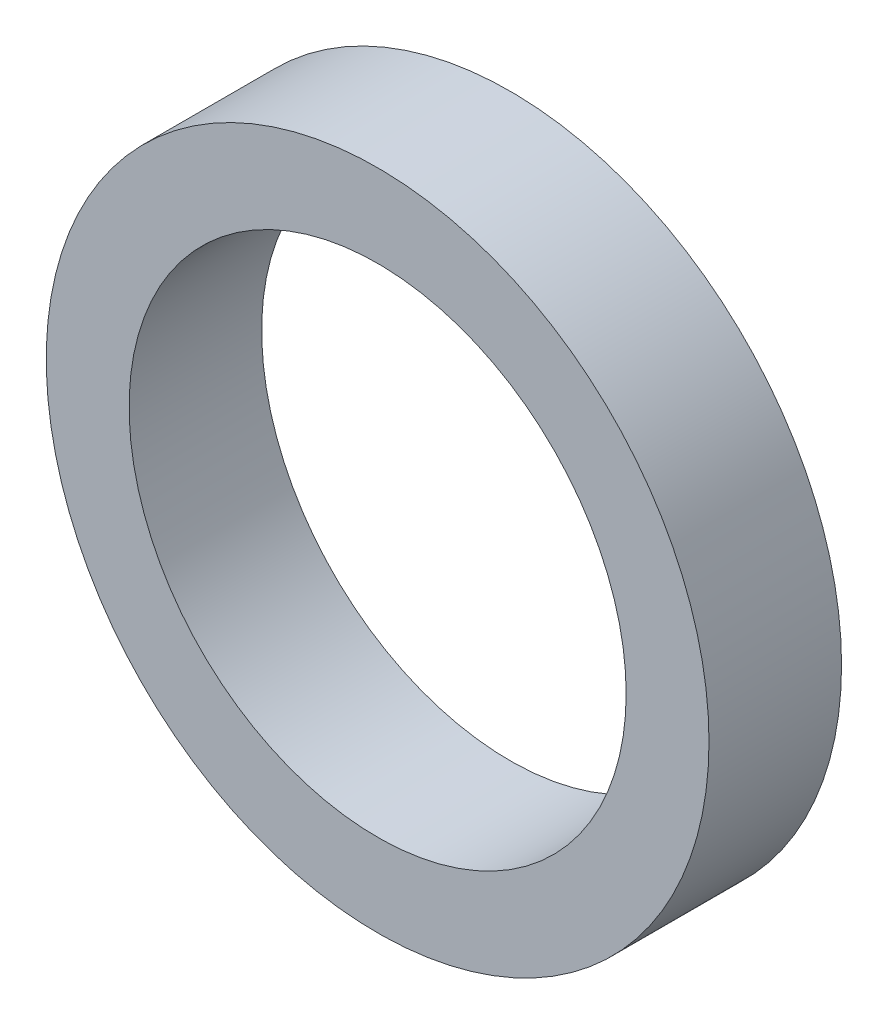
ISO-10303-21;
HEADER;
FILE_DESCRIPTION(('STEP AP214'),'2;1');
FILE_NAME('part.step','',(''),(''),'','','');
FILE_SCHEMA(('AUTOMOTIVE_DESIGN { 1 0 10303 214 1 1 1 1 }'));
ENDSEC;
DATA;
#1=APPLICATION_CONTEXT('core data for automotive mechanical design processes');
#2=APPLICATION_PROTOCOL_DEFINITION('international standard','automotive_design',2000,#1);
#3=PRODUCT_CONTEXT('',#1,'mechanical');
#4=PRODUCT('Part','Part','',(#3));
#5=PRODUCT_RELATED_PRODUCT_CATEGORY('part','',(#4));
#6=PRODUCT_DEFINITION_FORMATION('','',#4);
#7=PRODUCT_DEFINITION_CONTEXT('part definition',#1,'design');
#8=PRODUCT_DEFINITION('design','',#6,#7);
#9=PRODUCT_DEFINITION_SHAPE('','',#8);
#10=(LENGTH_UNIT() NAMED_UNIT(*) SI_UNIT(.MILLI.,.METRE.));
#11=(NAMED_UNIT(*) PLANE_ANGLE_UNIT() SI_UNIT($,.RADIAN.));
#12=(NAMED_UNIT(*) SI_UNIT($,.STERADIAN.) SOLID_ANGLE_UNIT());
#13=UNCERTAINTY_MEASURE_WITH_UNIT(LENGTH_MEASURE(1.E-05),#10,'distance_accuracy_value','');
#14=(GEOMETRIC_REPRESENTATION_CONTEXT(3) GLOBAL_UNCERTAINTY_ASSIGNED_CONTEXT((#13)) GLOBAL_UNIT_ASSIGNED_CONTEXT((#10,
#11,#12)) REPRESENTATION_CONTEXT('',''));
#15=CARTESIAN_POINT('',(0.,0.,0.));
#16=DIRECTION('',(0.,0.,1.));
#17=DIRECTION('',(1.,0.,0.));
#18=AXIS2_PLACEMENT_3D('',#15,#16,#17);
#19=CARTESIAN_POINT('',(0.,0.,5.08));
#20=DIRECTION('',(0.,0.,1.));
#21=DIRECTION('',(1.,0.,0.));
#22=AXIS2_PLACEMENT_3D('',#19,#20,#21);
#23=PLANE('',#22);
#24=CARTESIAN_POINT('',(0.,0.,5.08));
#25=DIRECTION('',(0.,0.,1.));
#26=DIRECTION('',(1.,0.,0.));
#27=AXIS2_PLACEMENT_3D('',#24,#25,#26);
#28=CIRCLE('',#27,12.7);
#29=CARTESIAN_POINT('',(12.7,0.,5.08));
#30=VERTEX_POINT('',#29);
#31=EDGE_CURVE('E10',#30,#30,#28,.T.);
#32=ORIENTED_EDGE('',*,*,#31,.T.);
#33=EDGE_LOOP('',(#32));
#34=FACE_BOUND('',#33,.T.);
#35=CARTESIAN_POINT('',(0.,0.,5.08));
#36=DIRECTION('',(0.,0.,1.));
#37=DIRECTION('',(1.,0.,0.));
#38=AXIS2_PLACEMENT_3D('',#35,#36,#37);
#39=CIRCLE('',#38,9.525);
#40=CARTESIAN_POINT('',(9.525,0.,5.08));
#41=VERTEX_POINT('',#40);
#42=EDGE_CURVE('E58',#41,#41,#39,.T.);
#43=ORIENTED_EDGE('',*,*,#42,.F.);
#44=EDGE_LOOP('',(#43));
#45=FACE_BOUND('',#44,.T.);
#46=ADVANCED_FACE('F43',(#34,#45),#23,.T.);
#47=CARTESIAN_POINT('',(0.,0.,0.));
#48=DIRECTION('',(0.,0.,1.));
#49=DIRECTION('',(1.,0.,0.));
#50=AXIS2_PLACEMENT_3D('',#47,#48,#49);
#51=PLANE('',#50);
#52=CARTESIAN_POINT('',(0.,0.,0.));
#53=DIRECTION('',(0.,0.,1.));
#54=DIRECTION('',(1.,0.,0.));
#55=AXIS2_PLACEMENT_3D('',#52,#53,#54);
#56=CIRCLE('',#55,12.7);
#57=CARTESIAN_POINT('',(12.7,0.,0.));
#58=VERTEX_POINT('',#57);
#59=EDGE_CURVE('E47',#58,#58,#56,.T.);
#60=ORIENTED_EDGE('',*,*,#59,.F.);
#61=EDGE_LOOP('',(#60));
#62=FACE_BOUND('',#61,.T.);
#63=CARTESIAN_POINT('',(0.,0.,0.));
#64=DIRECTION('',(0.,0.,1.));
#65=DIRECTION('',(1.,0.,0.));
#66=AXIS2_PLACEMENT_3D('',#63,#64,#65);
#67=CIRCLE('',#66,9.525);
#68=CARTESIAN_POINT('',(9.525,0.,0.));
#69=VERTEX_POINT('',#68);
#70=EDGE_CURVE('E60',#69,#69,#67,.T.);
#71=ORIENTED_EDGE('',*,*,#70,.T.);
#72=EDGE_LOOP('',(#71));
#73=FACE_BOUND('',#72,.T.);
#74=ADVANCED_FACE('F74',(#62,#73),#51,.F.);
#75=CARTESIAN_POINT('',(0.,0.,5.08));
#76=DIRECTION('',(0.,0.,-1.));
#77=DIRECTION('',(-1.,0.,0.));
#78=AXIS2_PLACEMENT_3D('',#75,#76,#77);
#79=CYLINDRICAL_SURFACE('',#78,12.7);
#80=ORIENTED_EDGE('',*,*,#31,.F.);
#81=EDGE_LOOP('',(#80));
#82=FACE_BOUND('',#81,.T.);
#83=ORIENTED_EDGE('',*,*,#59,.T.);
#84=EDGE_LOOP('',(#83));
#85=FACE_BOUND('',#84,.T.);
#86=ADVANCED_FACE('F45',(#82,#85),#79,.T.);
#87=CARTESIAN_POINT('',(0.,0.,5.08));
#88=DIRECTION('',(0.,0.,-1.));
#89=DIRECTION('',(-1.,0.,0.));
#90=AXIS2_PLACEMENT_3D('',#87,#88,#89);
#91=CYLINDRICAL_SURFACE('',#90,9.525);
#92=ORIENTED_EDGE('',*,*,#42,.T.);
#93=EDGE_LOOP('',(#92));
#94=FACE_BOUND('',#93,.T.);
#95=ORIENTED_EDGE('',*,*,#70,.F.);
#96=EDGE_LOOP('',(#95));
#97=FACE_BOUND('',#96,.T.);
#98=ADVANCED_FACE('F70',(#94,#97),#91,.F.);
#99=CLOSED_SHELL('',(#46,#74,#86,#98));
#100=MANIFOLD_SOLID_BREP('B2',#99);
#101=ADVANCED_BREP_SHAPE_REPRESENTATION('',(#18,#100),#14);
#102=SHAPE_DEFINITION_REPRESENTATION(#9,#101);
ENDSEC;
END-ISO-10303-21;
